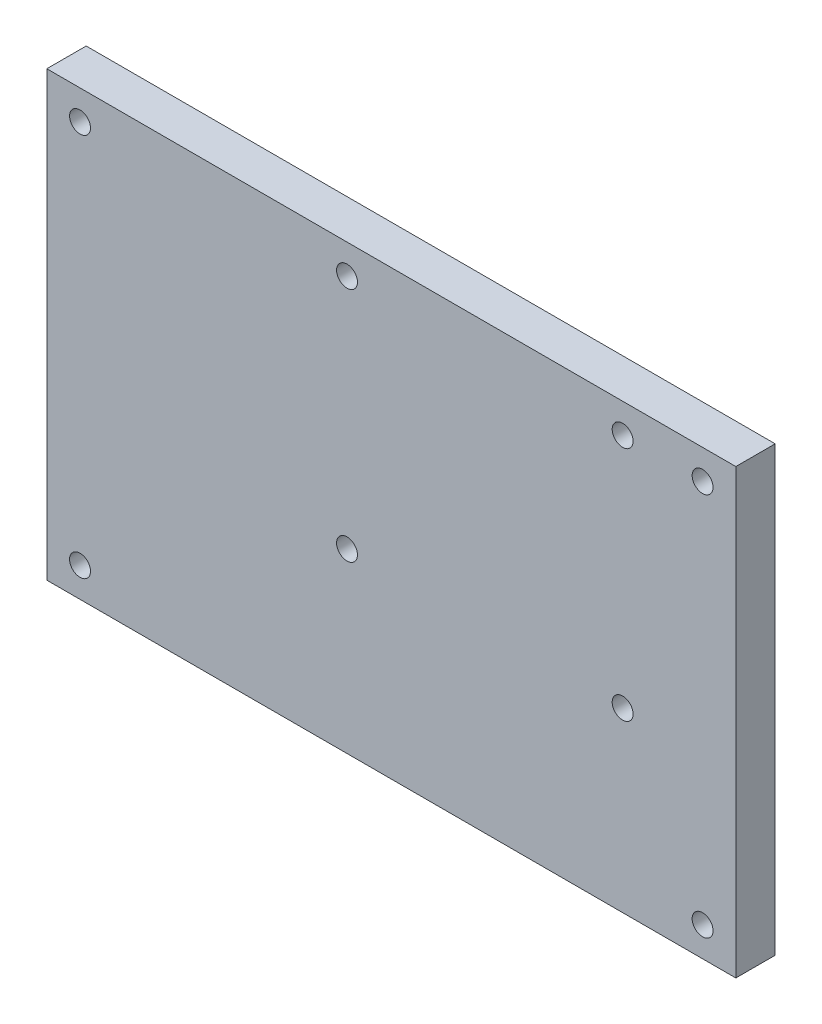
ISO-10303-21;
HEADER;
FILE_DESCRIPTION(('STEP AP214'),'2;1');
FILE_NAME('part.step','',(''),(''),'','','');
FILE_SCHEMA(('AUTOMOTIVE_DESIGN { 1 0 10303 214 1 1 1 1 }'));
ENDSEC;
DATA;
#1=APPLICATION_CONTEXT('core data for automotive mechanical design processes');
#2=APPLICATION_PROTOCOL_DEFINITION('international standard','automotive_design',2000,#1);
#3=PRODUCT_CONTEXT('',#1,'mechanical');
#4=PRODUCT('Part','Part','',(#3));
#5=PRODUCT_RELATED_PRODUCT_CATEGORY('part','',(#4));
#6=PRODUCT_DEFINITION_FORMATION('','',#4);
#7=PRODUCT_DEFINITION_CONTEXT('part definition',#1,'design');
#8=PRODUCT_DEFINITION('design','',#6,#7);
#9=PRODUCT_DEFINITION_SHAPE('','',#8);
#10=(LENGTH_UNIT() NAMED_UNIT(*) SI_UNIT(.MILLI.,.METRE.));
#11=(NAMED_UNIT(*) PLANE_ANGLE_UNIT() SI_UNIT($,.RADIAN.));
#12=(NAMED_UNIT(*) SI_UNIT($,.STERADIAN.) SOLID_ANGLE_UNIT());
#13=UNCERTAINTY_MEASURE_WITH_UNIT(LENGTH_MEASURE(1.E-05),#10,'distance_accuracy_value','');
#14=(GEOMETRIC_REPRESENTATION_CONTEXT(3) GLOBAL_UNCERTAINTY_ASSIGNED_CONTEXT((#13)) GLOBAL_UNIT_ASSIGNED_CONTEXT((#10,
#11,#12)) REPRESENTATION_CONTEXT('',''));
#15=CARTESIAN_POINT('',(0.,0.,0.));
#16=DIRECTION('',(0.,0.,1.));
#17=DIRECTION('',(1.,0.,0.));
#18=AXIS2_PLACEMENT_3D('',#15,#16,#17);
#19=CARTESIAN_POINT('',(0.,0.,25.4));
#20=DIRECTION('',(1.,0.,0.));
#21=DIRECTION('',(0.,0.,-1.));
#22=AXIS2_PLACEMENT_3D('',#19,#20,#21);
#23=PLANE('',#22);
#24=DIRECTION('',(0.,-1.,0.));
#25=VECTOR('',#24,1.);
#26=CARTESIAN_POINT('',(0.,0.,0.));
#27=LINE('',#26,#25);
#28=CARTESIAN_POINT('',(0.,285.75,0.));
#29=VERTEX_POINT('',#28);
#30=CARTESIAN_POINT('',(0.,0.,0.));
#31=VERTEX_POINT('',#30);
#32=EDGE_CURVE('E105',#29,#31,#27,.T.);
#33=ORIENTED_EDGE('',*,*,#32,.T.);
#34=DIRECTION('',(0.,0.,-1.));
#35=VECTOR('',#34,1.);
#36=CARTESIAN_POINT('',(0.,0.,25.4));
#37=LINE('',#36,#35);
#38=CARTESIAN_POINT('',(0.,0.,25.4));
#39=VERTEX_POINT('',#38);
#40=EDGE_CURVE('E11',#39,#31,#37,.T.);
#41=ORIENTED_EDGE('',*,*,#40,.F.);
#42=DIRECTION('',(0.,-1.,0.));
#43=VECTOR('',#42,1.);
#44=CARTESIAN_POINT('',(0.,0.,25.4));
#45=LINE('',#44,#43);
#46=CARTESIAN_POINT('',(0.,285.75,25.4));
#47=VERTEX_POINT('',#46);
#48=EDGE_CURVE('E92',#47,#39,#45,.T.);
#49=ORIENTED_EDGE('',*,*,#48,.F.);
#50=DIRECTION('',(0.,0.,-1.));
#51=VECTOR('',#50,1.);
#52=CARTESIAN_POINT('',(0.,285.75,25.4));
#53=LINE('',#52,#51);
#54=EDGE_CURVE('E101',#47,#29,#53,.T.);
#55=ORIENTED_EDGE('',*,*,#54,.T.);
#56=EDGE_LOOP('',(#33,#41,#49,#55));
#57=FACE_BOUND('',#56,.T.);
#58=ADVANCED_FACE('F39',(#57),#23,.F.);
#59=CARTESIAN_POINT('',(0.,0.,25.4));
#60=DIRECTION('',(0.,1.,0.));
#61=DIRECTION('',(0.,0.,1.));
#62=AXIS2_PLACEMENT_3D('',#59,#60,#61);
#63=PLANE('',#62);
#64=DIRECTION('',(1.,0.,0.));
#65=VECTOR('',#64,1.);
#66=CARTESIAN_POINT('',(0.,0.,0.));
#67=LINE('',#66,#65);
#68=CARTESIAN_POINT('',(444.5,0.,0.));
#69=VERTEX_POINT('',#68);
#70=EDGE_CURVE('E96',#31,#69,#67,.T.);
#71=ORIENTED_EDGE('',*,*,#70,.T.);
#72=DIRECTION('',(0.,0.,-1.));
#73=VECTOR('',#72,1.);
#74=CARTESIAN_POINT('',(444.5,0.,25.4));
#75=LINE('',#74,#73);
#76=CARTESIAN_POINT('',(444.5,0.,25.4));
#77=VERTEX_POINT('',#76);
#78=EDGE_CURVE('E48',#77,#69,#75,.T.);
#79=ORIENTED_EDGE('',*,*,#78,.F.);
#80=DIRECTION('',(1.,0.,0.));
#81=VECTOR('',#80,1.);
#82=CARTESIAN_POINT('',(0.,0.,25.4));
#83=LINE('',#82,#81);
#84=EDGE_CURVE('E87',#39,#77,#83,.T.);
#85=ORIENTED_EDGE('',*,*,#84,.F.);
#86=ORIENTED_EDGE('',*,*,#40,.T.);
#87=EDGE_LOOP('',(#71,#79,#85,#86));
#88=FACE_BOUND('',#87,.T.);
#89=ADVANCED_FACE('F95',(#88),#63,.F.);
#90=CARTESIAN_POINT('',(444.5,0.,25.4));
#91=DIRECTION('',(-1.,0.,0.));
#92=DIRECTION('',(0.,0.,1.));
#93=AXIS2_PLACEMENT_3D('',#90,#91,#92);
#94=PLANE('',#93);
#95=DIRECTION('',(0.,1.,0.));
#96=VECTOR('',#95,1.);
#97=CARTESIAN_POINT('',(444.5,0.,0.));
#98=LINE('',#97,#96);
#99=CARTESIAN_POINT('',(444.5,285.75,0.));
#100=VERTEX_POINT('',#99);
#101=EDGE_CURVE('E74',#69,#100,#98,.T.);
#102=ORIENTED_EDGE('',*,*,#101,.T.);
#103=DIRECTION('',(0.,0.,-1.));
#104=VECTOR('',#103,1.);
#105=CARTESIAN_POINT('',(444.5,285.75,25.4));
#106=LINE('',#105,#104);
#107=CARTESIAN_POINT('',(444.5,285.75,25.4));
#108=VERTEX_POINT('',#107);
#109=EDGE_CURVE('E97',#108,#100,#106,.T.);
#110=ORIENTED_EDGE('',*,*,#109,.F.);
#111=DIRECTION('',(0.,1.,0.));
#112=VECTOR('',#111,1.);
#113=CARTESIAN_POINT('',(444.5,0.,25.4));
#114=LINE('',#113,#112);
#115=EDGE_CURVE('E90',#77,#108,#114,.T.);
#116=ORIENTED_EDGE('',*,*,#115,.F.);
#117=ORIENTED_EDGE('',*,*,#78,.T.);
#118=EDGE_LOOP('',(#102,#110,#116,#117));
#119=FACE_BOUND('',#118,.T.);
#120=ADVANCED_FACE('F99',(#119),#94,.F.);
#121=CARTESIAN_POINT('',(0.,285.75,25.4));
#122=DIRECTION('',(0.,-1.,0.));
#123=DIRECTION('',(0.,0.,-1.));
#124=AXIS2_PLACEMENT_3D('',#121,#122,#123);
#125=PLANE('',#124);
#126=DIRECTION('',(-1.,0.,0.));
#127=VECTOR('',#126,1.);
#128=CARTESIAN_POINT('',(0.,285.75,0.));
#129=LINE('',#128,#127);
#130=EDGE_CURVE('E80',#100,#29,#129,.T.);
#131=ORIENTED_EDGE('',*,*,#130,.T.);
#132=ORIENTED_EDGE('',*,*,#54,.F.);
#133=DIRECTION('',(-1.,0.,0.));
#134=VECTOR('',#133,1.);
#135=CARTESIAN_POINT('',(0.,285.75,25.4));
#136=LINE('',#135,#134);
#137=EDGE_CURVE('E57',#108,#47,#136,.T.);
#138=ORIENTED_EDGE('',*,*,#137,.F.);
#139=ORIENTED_EDGE('',*,*,#109,.T.);
#140=EDGE_LOOP('',(#131,#132,#138,#139));
#141=FACE_BOUND('',#140,.T.);
#142=ADVANCED_FACE('F149',(#141),#125,.F.);
#143=CARTESIAN_POINT('',(0.,0.,25.4));
#144=DIRECTION('',(0.,0.,-1.));
#145=DIRECTION('',(-1.,0.,0.));
#146=AXIS2_PLACEMENT_3D('',#143,#144,#145);
#147=PLANE('',#146);
#148=CARTESIAN_POINT('',(371.475,114.3,25.4));
#149=DIRECTION('',(0.,0.,1.));
#150=DIRECTION('',(1.,0.,0.));
#151=AXIS2_PLACEMENT_3D('',#148,#149,#150);
#152=CIRCLE('',#151,6.74370000000001);
#153=CARTESIAN_POINT('',(378.2187,114.3,25.4));
#154=VERTEX_POINT('',#153);
#155=EDGE_CURVE('E331',#154,#154,#152,.T.);
#156=ORIENTED_EDGE('',*,*,#155,.F.);
#157=EDGE_LOOP('',(#156));
#158=FACE_BOUND('',#157,.T.);
#159=CARTESIAN_POINT('',(193.675,266.7,25.4));
#160=DIRECTION('',(0.,0.,1.));
#161=DIRECTION('',(1.,0.,0.));
#162=AXIS2_PLACEMENT_3D('',#159,#160,#161);
#163=CIRCLE('',#162,6.74369999999999);
#164=CARTESIAN_POINT('',(200.4187,266.7,25.4));
#165=VERTEX_POINT('',#164);
#166=EDGE_CURVE('E348',#165,#165,#163,.T.);
#167=ORIENTED_EDGE('',*,*,#166,.F.);
#168=EDGE_LOOP('',(#167));
#169=FACE_BOUND('',#168,.T.);
#170=CARTESIAN_POINT('',(371.475,266.7,25.4));
#171=DIRECTION('',(0.,0.,1.));
#172=DIRECTION('',(1.,0.,0.));
#173=AXIS2_PLACEMENT_3D('',#170,#171,#172);
#174=CIRCLE('',#173,6.74370000000002);
#175=CARTESIAN_POINT('',(378.2187,266.7,25.4));
#176=VERTEX_POINT('',#175);
#177=EDGE_CURVE('E343',#176,#176,#174,.T.);
#178=ORIENTED_EDGE('',*,*,#177,.F.);
#179=EDGE_LOOP('',(#178));
#180=FACE_BOUND('',#179,.T.);
#181=CARTESIAN_POINT('',(193.675,114.3,25.4));
#182=DIRECTION('',(0.,0.,1.));
#183=DIRECTION('',(1.,0.,0.));
#184=AXIS2_PLACEMENT_3D('',#181,#182,#183);
#185=CIRCLE('',#184,6.74369999999999);
#186=CARTESIAN_POINT('',(200.4187,114.3,25.4));
#187=VERTEX_POINT('',#186);
#188=EDGE_CURVE('E338',#187,#187,#185,.T.);
#189=ORIENTED_EDGE('',*,*,#188,.F.);
#190=EDGE_LOOP('',(#189));
#191=FACE_BOUND('',#190,.T.);
#192=CARTESIAN_POINT('',(423.0624,266.7,25.4));
#193=DIRECTION('',(0.,0.,1.));
#194=DIRECTION('',(1.,0.,0.));
#195=AXIS2_PLACEMENT_3D('',#192,#193,#194);
#196=CIRCLE('',#195,6.74370000000002);
#197=CARTESIAN_POINT('',(429.8061,266.7,25.4));
#198=VERTEX_POINT('',#197);
#199=EDGE_CURVE('E134',#198,#198,#196,.T.);
#200=ORIENTED_EDGE('',*,*,#199,.F.);
#201=EDGE_LOOP('',(#200));
#202=FACE_BOUND('',#201,.T.);
#203=CARTESIAN_POINT('',(21.4376,19.05,25.4));
#204=DIRECTION('',(0.,0.,1.));
#205=DIRECTION('',(1.,0.,0.));
#206=AXIS2_PLACEMENT_3D('',#203,#204,#205);
#207=CIRCLE('',#206,6.7437);
#208=CARTESIAN_POINT('',(28.1813,19.05,25.4));
#209=VERTEX_POINT('',#208);
#210=EDGE_CURVE('E129',#209,#209,#207,.T.);
#211=ORIENTED_EDGE('',*,*,#210,.F.);
#212=EDGE_LOOP('',(#211));
#213=FACE_BOUND('',#212,.T.);
#214=CARTESIAN_POINT('',(423.0624,19.05,25.4));
#215=DIRECTION('',(0.,0.,1.));
#216=DIRECTION('',(1.,0.,0.));
#217=AXIS2_PLACEMENT_3D('',#214,#215,#216);
#218=CIRCLE('',#217,6.74370000000001);
#219=CARTESIAN_POINT('',(429.8061,19.05,25.4));
#220=VERTEX_POINT('',#219);
#221=EDGE_CURVE('E125',#220,#220,#218,.T.);
#222=ORIENTED_EDGE('',*,*,#221,.F.);
#223=EDGE_LOOP('',(#222));
#224=FACE_BOUND('',#223,.T.);
#225=CARTESIAN_POINT('',(21.4376,266.7,25.4));
#226=DIRECTION('',(0.,0.,1.));
#227=DIRECTION('',(1.,0.,0.));
#228=AXIS2_PLACEMENT_3D('',#225,#226,#227);
#229=CIRCLE('',#228,6.74370000000001);
#230=CARTESIAN_POINT('',(28.1813,266.7,25.4));
#231=VERTEX_POINT('',#230);
#232=EDGE_CURVE('E108',#231,#231,#229,.T.);
#233=ORIENTED_EDGE('',*,*,#232,.F.);
#234=EDGE_LOOP('',(#233));
#235=FACE_BOUND('',#234,.T.);
#236=ORIENTED_EDGE('',*,*,#48,.T.);
#237=ORIENTED_EDGE('',*,*,#84,.T.);
#238=ORIENTED_EDGE('',*,*,#115,.T.);
#239=ORIENTED_EDGE('',*,*,#137,.T.);
#240=EDGE_LOOP('',(#236,#237,#238,#239));
#241=FACE_BOUND('',#240,.T.);
#242=ADVANCED_FACE('F88',(#158,#169,#180,#191,#202,#213,#224,#235,#241),#147,.F.);
#243=CARTESIAN_POINT('',(0.,0.,0.));
#244=DIRECTION('',(0.,0.,-1.));
#245=DIRECTION('',(-1.,0.,0.));
#246=AXIS2_PLACEMENT_3D('',#243,#244,#245);
#247=PLANE('',#246);
#248=CARTESIAN_POINT('',(371.475,114.3,0.));
#249=DIRECTION('',(0.,0.,1.));
#250=DIRECTION('',(1.,0.,0.));
#251=AXIS2_PLACEMENT_3D('',#248,#249,#250);
#252=CIRCLE('',#251,6.74370000000001);
#253=CARTESIAN_POINT('',(378.2187,114.3,0.));
#254=VERTEX_POINT('',#253);
#255=EDGE_CURVE('E334',#254,#254,#252,.T.);
#256=ORIENTED_EDGE('',*,*,#255,.T.);
#257=EDGE_LOOP('',(#256));
#258=FACE_BOUND('',#257,.T.);
#259=CARTESIAN_POINT('',(193.675,266.7,0.));
#260=DIRECTION('',(0.,0.,1.));
#261=DIRECTION('',(1.,0.,0.));
#262=AXIS2_PLACEMENT_3D('',#259,#260,#261);
#263=CIRCLE('',#262,6.74369999999999);
#264=CARTESIAN_POINT('',(200.4187,266.7,0.));
#265=VERTEX_POINT('',#264);
#266=EDGE_CURVE('E340',#265,#265,#263,.T.);
#267=ORIENTED_EDGE('',*,*,#266,.T.);
#268=EDGE_LOOP('',(#267));
#269=FACE_BOUND('',#268,.T.);
#270=CARTESIAN_POINT('',(371.475,266.7,0.));
#271=DIRECTION('',(0.,0.,1.));
#272=DIRECTION('',(1.,0.,0.));
#273=AXIS2_PLACEMENT_3D('',#270,#271,#272);
#274=CIRCLE('',#273,6.74370000000002);
#275=CARTESIAN_POINT('',(378.2187,266.7,0.));
#276=VERTEX_POINT('',#275);
#277=EDGE_CURVE('E351',#276,#276,#274,.T.);
#278=ORIENTED_EDGE('',*,*,#277,.T.);
#279=EDGE_LOOP('',(#278));
#280=FACE_BOUND('',#279,.T.);
#281=CARTESIAN_POINT('',(193.675,114.3,0.));
#282=DIRECTION('',(0.,0.,1.));
#283=DIRECTION('',(1.,0.,0.));
#284=AXIS2_PLACEMENT_3D('',#281,#282,#283);
#285=CIRCLE('',#284,6.74369999999999);
#286=CARTESIAN_POINT('',(200.4187,114.3,0.));
#287=VERTEX_POINT('',#286);
#288=EDGE_CURVE('E335',#287,#287,#285,.T.);
#289=ORIENTED_EDGE('',*,*,#288,.T.);
#290=EDGE_LOOP('',(#289));
#291=FACE_BOUND('',#290,.T.);
#292=CARTESIAN_POINT('',(423.0624,266.7,0.));
#293=DIRECTION('',(0.,0.,1.));
#294=DIRECTION('',(1.,0.,0.));
#295=AXIS2_PLACEMENT_3D('',#292,#293,#294);
#296=CIRCLE('',#295,9.52500000000002);
#297=CARTESIAN_POINT('',(413.5374,266.7,0.));
#298=VERTEX_POINT('',#297);
#299=EDGE_CURVE('E361',#298,#298,#296,.T.);
#300=ORIENTED_EDGE('',*,*,#299,.T.);
#301=EDGE_LOOP('',(#300));
#302=FACE_BOUND('',#301,.T.);
#303=CARTESIAN_POINT('',(21.4376,19.05,0.));
#304=DIRECTION('',(0.,0.,1.));
#305=DIRECTION('',(1.,0.,0.));
#306=AXIS2_PLACEMENT_3D('',#303,#304,#305);
#307=CIRCLE('',#306,9.525);
#308=CARTESIAN_POINT('',(11.9126,19.05,0.));
#309=VERTEX_POINT('',#308);
#310=EDGE_CURVE('E367',#309,#309,#307,.T.);
#311=ORIENTED_EDGE('',*,*,#310,.T.);
#312=EDGE_LOOP('',(#311));
#313=FACE_BOUND('',#312,.T.);
#314=CARTESIAN_POINT('',(423.0624,19.05,0.));
#315=DIRECTION('',(0.,0.,1.));
#316=DIRECTION('',(1.,0.,0.));
#317=AXIS2_PLACEMENT_3D('',#314,#315,#316);
#318=CIRCLE('',#317,9.52500000000002);
#319=CARTESIAN_POINT('',(413.5374,19.05,0.));
#320=VERTEX_POINT('',#319);
#321=EDGE_CURVE('E355',#320,#320,#318,.T.);
#322=ORIENTED_EDGE('',*,*,#321,.T.);
#323=EDGE_LOOP('',(#322));
#324=FACE_BOUND('',#323,.T.);
#325=CARTESIAN_POINT('',(21.4376,266.7,0.));
#326=DIRECTION('',(0.,0.,1.));
#327=DIRECTION('',(1.,0.,0.));
#328=AXIS2_PLACEMENT_3D('',#325,#326,#327);
#329=CIRCLE('',#328,9.525);
#330=CARTESIAN_POINT('',(11.9126,266.7,0.));
#331=VERTEX_POINT('',#330);
#332=EDGE_CURVE('E138',#331,#331,#329,.T.);
#333=ORIENTED_EDGE('',*,*,#332,.T.);
#334=EDGE_LOOP('',(#333));
#335=FACE_BOUND('',#334,.T.);
#336=ORIENTED_EDGE('',*,*,#32,.F.);
#337=ORIENTED_EDGE('',*,*,#130,.F.);
#338=ORIENTED_EDGE('',*,*,#101,.F.);
#339=ORIENTED_EDGE('',*,*,#70,.F.);
#340=EDGE_LOOP('',(#336,#337,#338,#339));
#341=FACE_BOUND('',#340,.T.);
#342=ADVANCED_FACE('F148',(#258,#269,#280,#291,#302,#313,#324,#335,#341),#247,.T.);
#343=CARTESIAN_POINT('',(21.4376,266.7,25.4));
#344=DIRECTION('',(0.,0.,-1.));
#345=DIRECTION('',(-1.,0.,0.));
#346=AXIS2_PLACEMENT_3D('',#343,#344,#345);
#347=CYLINDRICAL_SURFACE('',#346,6.74370000000001);
#348=CARTESIAN_POINT('',(21.4376,266.7,7.62));
#349=DIRECTION('',(0.,0.,1.));
#350=DIRECTION('',(1.,0.,0.));
#351=AXIS2_PLACEMENT_3D('',#348,#349,#350);
#352=CIRCLE('',#351,6.74370000000001);
#353=CARTESIAN_POINT('',(28.1813,266.7,7.62));
#354=VERTEX_POINT('',#353);
#355=EDGE_CURVE('E42',#354,#354,#352,.T.);
#356=ORIENTED_EDGE('',*,*,#355,.F.);
#357=EDGE_LOOP('',(#356));
#358=FACE_BOUND('',#357,.T.);
#359=ORIENTED_EDGE('',*,*,#232,.T.);
#360=EDGE_LOOP('',(#359));
#361=FACE_BOUND('',#360,.T.);
#362=ADVANCED_FACE('F145',(#358,#361),#347,.F.);
#363=CARTESIAN_POINT('',(423.0624,19.05,25.4));
#364=DIRECTION('',(0.,0.,-1.));
#365=DIRECTION('',(-1.,0.,0.));
#366=AXIS2_PLACEMENT_3D('',#363,#364,#365);
#367=CYLINDRICAL_SURFACE('',#366,6.74370000000001);
#368=CARTESIAN_POINT('',(423.0624,19.05,7.62));
#369=DIRECTION('',(0.,0.,1.));
#370=DIRECTION('',(1.,0.,0.));
#371=AXIS2_PLACEMENT_3D('',#368,#369,#370);
#372=CIRCLE('',#371,6.74370000000001);
#373=CARTESIAN_POINT('',(429.8061,19.05,7.62));
#374=VERTEX_POINT('',#373);
#375=EDGE_CURVE('E120',#374,#374,#372,.T.);
#376=ORIENTED_EDGE('',*,*,#375,.F.);
#377=EDGE_LOOP('',(#376));
#378=FACE_BOUND('',#377,.T.);
#379=ORIENTED_EDGE('',*,*,#221,.T.);
#380=EDGE_LOOP('',(#379));
#381=FACE_BOUND('',#380,.T.);
#382=ADVANCED_FACE('F188',(#378,#381),#367,.F.);
#383=CARTESIAN_POINT('',(21.4376,19.05,25.4));
#384=DIRECTION('',(0.,0.,-1.));
#385=DIRECTION('',(-1.,0.,0.));
#386=AXIS2_PLACEMENT_3D('',#383,#384,#385);
#387=CYLINDRICAL_SURFACE('',#386,6.7437);
#388=CARTESIAN_POINT('',(21.4376,19.05,7.62));
#389=DIRECTION('',(0.,0.,1.));
#390=DIRECTION('',(1.,0.,0.));
#391=AXIS2_PLACEMENT_3D('',#388,#389,#390);
#392=CIRCLE('',#391,6.7437);
#393=CARTESIAN_POINT('',(28.1813,19.05,7.62));
#394=VERTEX_POINT('',#393);
#395=EDGE_CURVE('E117',#394,#394,#392,.T.);
#396=ORIENTED_EDGE('',*,*,#395,.F.);
#397=EDGE_LOOP('',(#396));
#398=FACE_BOUND('',#397,.T.);
#399=ORIENTED_EDGE('',*,*,#210,.T.);
#400=EDGE_LOOP('',(#399));
#401=FACE_BOUND('',#400,.T.);
#402=ADVANCED_FACE('F197',(#398,#401),#387,.F.);
#403=CARTESIAN_POINT('',(423.0624,266.7,25.4));
#404=DIRECTION('',(0.,0.,-1.));
#405=DIRECTION('',(-1.,0.,0.));
#406=AXIS2_PLACEMENT_3D('',#403,#404,#405);
#407=CYLINDRICAL_SURFACE('',#406,6.74370000000002);
#408=CARTESIAN_POINT('',(423.0624,266.7,7.62));
#409=DIRECTION('',(0.,0.,1.));
#410=DIRECTION('',(1.,0.,0.));
#411=AXIS2_PLACEMENT_3D('',#408,#409,#410);
#412=CIRCLE('',#411,6.74370000000002);
#413=CARTESIAN_POINT('',(429.8061,266.7,7.62));
#414=VERTEX_POINT('',#413);
#415=EDGE_CURVE('E114',#414,#414,#412,.T.);
#416=ORIENTED_EDGE('',*,*,#415,.F.);
#417=EDGE_LOOP('',(#416));
#418=FACE_BOUND('',#417,.T.);
#419=ORIENTED_EDGE('',*,*,#199,.T.);
#420=EDGE_LOOP('',(#419));
#421=FACE_BOUND('',#420,.T.);
#422=ADVANCED_FACE('F206',(#418,#421),#407,.F.);
#423=CARTESIAN_POINT('',(423.0624,266.7,7.62));
#424=DIRECTION('',(0.,0.,-1.));
#425=DIRECTION('',(-1.,0.,0.));
#426=AXIS2_PLACEMENT_3D('',#423,#424,#425);
#427=CYLINDRICAL_SURFACE('',#426,9.52500000000002);
#428=CARTESIAN_POINT('',(423.0624,266.7,7.62));
#429=DIRECTION('',(0.,0.,1.));
#430=DIRECTION('',(1.,0.,0.));
#431=AXIS2_PLACEMENT_3D('',#428,#429,#430);
#432=CIRCLE('',#431,9.52500000000002);
#433=CARTESIAN_POINT('',(413.5374,266.7,7.62));
#434=VERTEX_POINT('',#433);
#435=EDGE_CURVE('E364',#434,#434,#432,.T.);
#436=CARTESIAN_POINT('',(413.5374,266.7,7.62));
#437=CARTESIAN_POINT('',(413.5374,266.7,7.540625));
#438=CARTESIAN_POINT('',(413.5374,266.7,7.46125));
#439=CARTESIAN_POINT('',(413.5374,266.7,7.3025));
#440=CARTESIAN_POINT('',(413.5374,266.7,7.223125));
#441=CARTESIAN_POINT('',(413.5374,266.7,7.064375));
#442=CARTESIAN_POINT('',(413.5374,266.7,6.985));
#443=CARTESIAN_POINT('',(413.5374,266.7,6.82625));
#444=CARTESIAN_POINT('',(413.5374,266.7,6.746875));
#445=CARTESIAN_POINT('',(413.5374,266.7,6.588125));
#446=CARTESIAN_POINT('',(413.5374,266.7,6.50875));
#447=CARTESIAN_POINT('',(413.5374,266.7,6.35));
#448=CARTESIAN_POINT('',(413.5374,266.7,6.270625));
#449=CARTESIAN_POINT('',(413.5374,266.7,6.111875));
#450=CARTESIAN_POINT('',(413.5374,266.7,6.0325));
#451=CARTESIAN_POINT('',(413.5374,266.7,5.87375));
#452=CARTESIAN_POINT('',(413.5374,266.7,5.794375));
#453=CARTESIAN_POINT('',(413.5374,266.7,5.635625));
#454=CARTESIAN_POINT('',(413.5374,266.7,5.55625));
#455=CARTESIAN_POINT('',(413.5374,266.7,5.3975));
#456=CARTESIAN_POINT('',(413.5374,266.7,5.318125));
#457=CARTESIAN_POINT('',(413.5374,266.7,5.159375));
#458=CARTESIAN_POINT('',(413.5374,266.7,5.08));
#459=CARTESIAN_POINT('',(413.5374,266.7,4.92125));
#460=CARTESIAN_POINT('',(413.5374,266.7,4.841875));
#461=CARTESIAN_POINT('',(413.5374,266.7,4.683125));
#462=CARTESIAN_POINT('',(413.5374,266.7,4.60375));
#463=CARTESIAN_POINT('',(413.5374,266.7,4.445));
#464=CARTESIAN_POINT('',(413.5374,266.7,4.365625));
#465=CARTESIAN_POINT('',(413.5374,266.7,4.206875));
#466=CARTESIAN_POINT('',(413.5374,266.7,4.1275));
#467=CARTESIAN_POINT('',(413.5374,266.7,3.96875));
#468=CARTESIAN_POINT('',(413.5374,266.7,3.889375));
#469=CARTESIAN_POINT('',(413.5374,266.7,3.730625));
#470=CARTESIAN_POINT('',(413.5374,266.7,3.65125));
#471=CARTESIAN_POINT('',(413.5374,266.7,3.4925));
#472=CARTESIAN_POINT('',(413.5374,266.7,3.413125));
#473=CARTESIAN_POINT('',(413.5374,266.7,3.254375));
#474=CARTESIAN_POINT('',(413.5374,266.7,3.175));
#475=CARTESIAN_POINT('',(413.5374,266.7,3.01625));
#476=CARTESIAN_POINT('',(413.5374,266.7,2.936875));
#477=CARTESIAN_POINT('',(413.5374,266.7,2.778125));
#478=CARTESIAN_POINT('',(413.5374,266.7,2.69875));
#479=CARTESIAN_POINT('',(413.5374,266.7,2.54));
#480=CARTESIAN_POINT('',(413.5374,266.7,2.460625));
#481=CARTESIAN_POINT('',(413.5374,266.7,2.301875));
#482=CARTESIAN_POINT('',(413.5374,266.7,2.2225));
#483=CARTESIAN_POINT('',(413.5374,266.7,2.06375));
#484=CARTESIAN_POINT('',(413.5374,266.7,1.984375));
#485=CARTESIAN_POINT('',(413.5374,266.7,1.825625));
#486=CARTESIAN_POINT('',(413.5374,266.7,1.74625));
#487=CARTESIAN_POINT('',(413.5374,266.7,1.5875));
#488=CARTESIAN_POINT('',(413.5374,266.7,1.508125));
#489=CARTESIAN_POINT('',(413.5374,266.7,1.349375));
#490=CARTESIAN_POINT('',(413.5374,266.7,1.27));
#491=CARTESIAN_POINT('',(413.5374,266.7,1.11125));
#492=CARTESIAN_POINT('',(413.5374,266.7,1.031875));
#493=CARTESIAN_POINT('',(413.5374,266.7,0.873125));
#494=CARTESIAN_POINT('',(413.5374,266.7,0.79375));
#495=CARTESIAN_POINT('',(413.5374,266.7,0.635));
#496=CARTESIAN_POINT('',(413.5374,266.7,0.555625));
#497=CARTESIAN_POINT('',(413.5374,266.7,0.396875));
#498=CARTESIAN_POINT('',(413.5374,266.7,0.3175));
#499=CARTESIAN_POINT('',(413.5374,266.7,0.15875));
#500=CARTESIAN_POINT('',(413.5374,266.7,0.0793749999999999));
#501=CARTESIAN_POINT('',(413.5374,266.7,0.));
#502=B_SPLINE_CURVE_WITH_KNOTS('',3,(#436,#437,#438,#439,#440,#441,#442,#443,#444,#445,#446,
#447,#448,#449,#450,#451,#452,#453,#454,#455,#456,#457,#458,#459,#460,#461,#462,#463,#464,#465,
#466,#467,#468,#469,#470,#471,#472,#473,#474,#475,#476,#477,#478,#479,#480,#481,#482,#483,#484,
#485,#486,#487,#488,#489,#490,#491,#492,#493,#494,#495,#496,#497,#498,#499,#500,#501),
.UNSPECIFIED.,.F.,.F.,(4,2,2,2,2,2,2,2,2,2,2,2,2,2,2,2,2,2,2,2,2,2,2,2,2,2,2,2,2,2,2,2,4),(0.,
0.238125,0.476249999999999,0.714375,0.952499999999999,1.190625,1.42875,1.666875,1.905,2.143125,
2.38125,2.619375,2.8575,3.095625,3.33375,3.571875,3.81,4.048125,4.28625,4.524375,4.7625,
5.000625,5.23875,5.476875,5.715,5.953125,6.19125,6.429375,6.6675,6.905625,7.14375,7.381875,
7.62),.UNSPECIFIED.);
#503=EDGE_CURVE('BSEAM215',#434,#298,#502,.T.);
#504=ORIENTED_EDGE('',*,*,#435,.T.);
#505=ORIENTED_EDGE('',*,*,#299,.F.);
#506=ORIENTED_EDGE('',*,*,#503,.T.);
#507=ORIENTED_EDGE('',*,*,#503,.F.);
#508=EDGE_LOOP('',(#504,#506,#505,#507));
#509=FACE_BOUND('',#508,.T.);
#510=ADVANCED_FACE('F215',(#509),#427,.F.);
#511=CARTESIAN_POINT('',(423.0624,266.7,7.62));
#512=DIRECTION('',(0.,0.,1.));
#513=DIRECTION('',(1.,0.,0.));
#514=AXIS2_PLACEMENT_3D('',#511,#512,#513);
#515=PLANE('',#514);
#516=ORIENTED_EDGE('',*,*,#415,.T.);
#517=EDGE_LOOP('',(#516));
#518=FACE_BOUND('',#517,.T.);
#519=ORIENTED_EDGE('',*,*,#435,.F.);
#520=EDGE_LOOP('',(#519));
#521=FACE_BOUND('',#520,.T.);
#522=ADVANCED_FACE('F224',(#518,#521),#515,.F.);
#523=CARTESIAN_POINT('',(21.4376,19.05,7.62));
#524=DIRECTION('',(0.,0.,-1.));
#525=DIRECTION('',(-1.,0.,0.));
#526=AXIS2_PLACEMENT_3D('',#523,#524,#525);
#527=CYLINDRICAL_SURFACE('',#526,9.525);
#528=CARTESIAN_POINT('',(21.4376,19.05,7.62));
#529=DIRECTION('',(0.,0.,1.));
#530=DIRECTION('',(1.,0.,0.));
#531=AXIS2_PLACEMENT_3D('',#528,#529,#530);
#532=CIRCLE('',#531,9.525);
#533=CARTESIAN_POINT('',(11.9126,19.05,7.62));
#534=VERTEX_POINT('',#533);
#535=EDGE_CURVE('E358',#534,#534,#532,.T.);
#536=CARTESIAN_POINT('',(11.9126,19.05,7.62));
#537=CARTESIAN_POINT('',(11.9126,19.05,7.540625));
#538=CARTESIAN_POINT('',(11.9126,19.05,7.46125));
#539=CARTESIAN_POINT('',(11.9126,19.05,7.3025));
#540=CARTESIAN_POINT('',(11.9126,19.05,7.223125));
#541=CARTESIAN_POINT('',(11.9126,19.05,7.064375));
#542=CARTESIAN_POINT('',(11.9126,19.05,6.985));
#543=CARTESIAN_POINT('',(11.9126,19.05,6.82625));
#544=CARTESIAN_POINT('',(11.9126,19.05,6.746875));
#545=CARTESIAN_POINT('',(11.9126,19.05,6.588125));
#546=CARTESIAN_POINT('',(11.9126,19.05,6.50875));
#547=CARTESIAN_POINT('',(11.9126,19.05,6.35));
#548=CARTESIAN_POINT('',(11.9126,19.05,6.270625));
#549=CARTESIAN_POINT('',(11.9126,19.05,6.111875));
#550=CARTESIAN_POINT('',(11.9126,19.05,6.0325));
#551=CARTESIAN_POINT('',(11.9126,19.05,5.87375));
#552=CARTESIAN_POINT('',(11.9126,19.05,5.794375));
#553=CARTESIAN_POINT('',(11.9126,19.05,5.635625));
#554=CARTESIAN_POINT('',(11.9126,19.05,5.55625));
#555=CARTESIAN_POINT('',(11.9126,19.05,5.3975));
#556=CARTESIAN_POINT('',(11.9126,19.05,5.318125));
#557=CARTESIAN_POINT('',(11.9126,19.05,5.159375));
#558=CARTESIAN_POINT('',(11.9126,19.05,5.08));
#559=CARTESIAN_POINT('',(11.9126,19.05,4.92125));
#560=CARTESIAN_POINT('',(11.9126,19.05,4.841875));
#561=CARTESIAN_POINT('',(11.9126,19.05,4.683125));
#562=CARTESIAN_POINT('',(11.9126,19.05,4.60375));
#563=CARTESIAN_POINT('',(11.9126,19.05,4.445));
#564=CARTESIAN_POINT('',(11.9126,19.05,4.365625));
#565=CARTESIAN_POINT('',(11.9126,19.05,4.206875));
#566=CARTESIAN_POINT('',(11.9126,19.05,4.1275));
#567=CARTESIAN_POINT('',(11.9126,19.05,3.96875));
#568=CARTESIAN_POINT('',(11.9126,19.05,3.889375));
#569=CARTESIAN_POINT('',(11.9126,19.05,3.730625));
#570=CARTESIAN_POINT('',(11.9126,19.05,3.65125));
#571=CARTESIAN_POINT('',(11.9126,19.05,3.4925));
#572=CARTESIAN_POINT('',(11.9126,19.05,3.413125));
#573=CARTESIAN_POINT('',(11.9126,19.05,3.254375));
#574=CARTESIAN_POINT('',(11.9126,19.05,3.175));
#575=CARTESIAN_POINT('',(11.9126,19.05,3.01625));
#576=CARTESIAN_POINT('',(11.9126,19.05,2.936875));
#577=CARTESIAN_POINT('',(11.9126,19.05,2.778125));
#578=CARTESIAN_POINT('',(11.9126,19.05,2.69875));
#579=CARTESIAN_POINT('',(11.9126,19.05,2.54));
#580=CARTESIAN_POINT('',(11.9126,19.05,2.460625));
#581=CARTESIAN_POINT('',(11.9126,19.05,2.301875));
#582=CARTESIAN_POINT('',(11.9126,19.05,2.2225));
#583=CARTESIAN_POINT('',(11.9126,19.05,2.06375));
#584=CARTESIAN_POINT('',(11.9126,19.05,1.984375));
#585=CARTESIAN_POINT('',(11.9126,19.05,1.825625));
#586=CARTESIAN_POINT('',(11.9126,19.05,1.74625));
#587=CARTESIAN_POINT('',(11.9126,19.05,1.5875));
#588=CARTESIAN_POINT('',(11.9126,19.05,1.508125));
#589=CARTESIAN_POINT('',(11.9126,19.05,1.349375));
#590=CARTESIAN_POINT('',(11.9126,19.05,1.27));
#591=CARTESIAN_POINT('',(11.9126,19.05,1.11125));
#592=CARTESIAN_POINT('',(11.9126,19.05,1.031875));
#593=CARTESIAN_POINT('',(11.9126,19.05,0.873125));
#594=CARTESIAN_POINT('',(11.9126,19.05,0.79375));
#595=CARTESIAN_POINT('',(11.9126,19.05,0.635));
#596=CARTESIAN_POINT('',(11.9126,19.05,0.555625));
#597=CARTESIAN_POINT('',(11.9126,19.05,0.396875));
#598=CARTESIAN_POINT('',(11.9126,19.05,0.3175));
#599=CARTESIAN_POINT('',(11.9126,19.05,0.15875));
#600=CARTESIAN_POINT('',(11.9126,19.05,0.0793749999999999));
#601=CARTESIAN_POINT('',(11.9126,19.05,0.));
#602=B_SPLINE_CURVE_WITH_KNOTS('',3,(#536,#537,#538,#539,#540,#541,#542,#543,#544,#545,#546,
#547,#548,#549,#550,#551,#552,#553,#554,#555,#556,#557,#558,#559,#560,#561,#562,#563,#564,#565,
#566,#567,#568,#569,#570,#571,#572,#573,#574,#575,#576,#577,#578,#579,#580,#581,#582,#583,#584,
#585,#586,#587,#588,#589,#590,#591,#592,#593,#594,#595,#596,#597,#598,#599,#600,#601),
.UNSPECIFIED.,.F.,.F.,(4,2,2,2,2,2,2,2,2,2,2,2,2,2,2,2,2,2,2,2,2,2,2,2,2,2,2,2,2,2,2,2,4),(0.,
0.238125,0.476249999999999,0.714375,0.952499999999999,1.190625,1.42875,1.666875,1.905,2.143125,
2.38125,2.619375,2.8575,3.095625,3.33375,3.571875,3.81,4.048125,4.28625,4.524375,4.7625,
5.000625,5.23875,5.476875,5.715,5.953125,6.19125,6.429375,6.6675,6.905625,7.14375,7.381875,
7.62),.UNSPECIFIED.);
#603=EDGE_CURVE('BSEAM233',#534,#309,#602,.T.);
#604=ORIENTED_EDGE('',*,*,#535,.T.);
#605=ORIENTED_EDGE('',*,*,#310,.F.);
#606=ORIENTED_EDGE('',*,*,#603,.T.);
#607=ORIENTED_EDGE('',*,*,#603,.F.);
#608=EDGE_LOOP('',(#604,#606,#605,#607));
#609=FACE_BOUND('',#608,.T.);
#610=ADVANCED_FACE('F233',(#609),#527,.F.);
#611=CARTESIAN_POINT('',(21.4376,19.05,7.62));
#612=DIRECTION('',(0.,0.,1.));
#613=DIRECTION('',(1.,0.,0.));
#614=AXIS2_PLACEMENT_3D('',#611,#612,#613);
#615=PLANE('',#614);
#616=ORIENTED_EDGE('',*,*,#395,.T.);
#617=EDGE_LOOP('',(#616));
#618=FACE_BOUND('',#617,.T.);
#619=ORIENTED_EDGE('',*,*,#535,.F.);
#620=EDGE_LOOP('',(#619));
#621=FACE_BOUND('',#620,.T.);
#622=ADVANCED_FACE('F242',(#618,#621),#615,.F.);
#623=CARTESIAN_POINT('',(423.0624,19.05,7.62));
#624=DIRECTION('',(0.,0.,-1.));
#625=DIRECTION('',(-1.,0.,0.));
#626=AXIS2_PLACEMENT_3D('',#623,#624,#625);
#627=CYLINDRICAL_SURFACE('',#626,9.52500000000002);
#628=CARTESIAN_POINT('',(423.0624,19.05,7.62));
#629=DIRECTION('',(0.,0.,1.));
#630=DIRECTION('',(1.,0.,0.));
#631=AXIS2_PLACEMENT_3D('',#628,#629,#630);
#632=CIRCLE('',#631,9.52500000000002);
#633=CARTESIAN_POINT('',(413.5374,19.05,7.62));
#634=VERTEX_POINT('',#633);
#635=EDGE_CURVE('E353',#634,#634,#632,.T.);
#636=CARTESIAN_POINT('',(413.5374,19.05,7.62));
#637=CARTESIAN_POINT('',(413.5374,19.05,7.540625));
#638=CARTESIAN_POINT('',(413.5374,19.05,7.46125));
#639=CARTESIAN_POINT('',(413.5374,19.05,7.3025));
#640=CARTESIAN_POINT('',(413.5374,19.05,7.223125));
#641=CARTESIAN_POINT('',(413.5374,19.05,7.064375));
#642=CARTESIAN_POINT('',(413.5374,19.05,6.985));
#643=CARTESIAN_POINT('',(413.5374,19.05,6.82625));
#644=CARTESIAN_POINT('',(413.5374,19.05,6.746875));
#645=CARTESIAN_POINT('',(413.5374,19.05,6.588125));
#646=CARTESIAN_POINT('',(413.5374,19.05,6.50875));
#647=CARTESIAN_POINT('',(413.5374,19.05,6.35));
#648=CARTESIAN_POINT('',(413.5374,19.05,6.270625));
#649=CARTESIAN_POINT('',(413.5374,19.05,6.111875));
#650=CARTESIAN_POINT('',(413.5374,19.05,6.0325));
#651=CARTESIAN_POINT('',(413.5374,19.05,5.87375));
#652=CARTESIAN_POINT('',(413.5374,19.05,5.794375));
#653=CARTESIAN_POINT('',(413.5374,19.05,5.635625));
#654=CARTESIAN_POINT('',(413.5374,19.05,5.55625));
#655=CARTESIAN_POINT('',(413.5374,19.05,5.3975));
#656=CARTESIAN_POINT('',(413.5374,19.05,5.318125));
#657=CARTESIAN_POINT('',(413.5374,19.05,5.159375));
#658=CARTESIAN_POINT('',(413.5374,19.05,5.08));
#659=CARTESIAN_POINT('',(413.5374,19.05,4.92125));
#660=CARTESIAN_POINT('',(413.5374,19.05,4.841875));
#661=CARTESIAN_POINT('',(413.5374,19.05,4.683125));
#662=CARTESIAN_POINT('',(413.5374,19.05,4.60375));
#663=CARTESIAN_POINT('',(413.5374,19.05,4.445));
#664=CARTESIAN_POINT('',(413.5374,19.05,4.365625));
#665=CARTESIAN_POINT('',(413.5374,19.05,4.206875));
#666=CARTESIAN_POINT('',(413.5374,19.05,4.1275));
#667=CARTESIAN_POINT('',(413.5374,19.05,3.96875));
#668=CARTESIAN_POINT('',(413.5374,19.05,3.889375));
#669=CARTESIAN_POINT('',(413.5374,19.05,3.730625));
#670=CARTESIAN_POINT('',(413.5374,19.05,3.65125));
#671=CARTESIAN_POINT('',(413.5374,19.05,3.4925));
#672=CARTESIAN_POINT('',(413.5374,19.05,3.413125));
#673=CARTESIAN_POINT('',(413.5374,19.05,3.254375));
#674=CARTESIAN_POINT('',(413.5374,19.05,3.175));
#675=CARTESIAN_POINT('',(413.5374,19.05,3.01625));
#676=CARTESIAN_POINT('',(413.5374,19.05,2.936875));
#677=CARTESIAN_POINT('',(413.5374,19.05,2.778125));
#678=CARTESIAN_POINT('',(413.5374,19.05,2.69875));
#679=CARTESIAN_POINT('',(413.5374,19.05,2.54));
#680=CARTESIAN_POINT('',(413.5374,19.05,2.460625));
#681=CARTESIAN_POINT('',(413.5374,19.05,2.301875));
#682=CARTESIAN_POINT('',(413.5374,19.05,2.2225));
#683=CARTESIAN_POINT('',(413.5374,19.05,2.06375));
#684=CARTESIAN_POINT('',(413.5374,19.05,1.984375));
#685=CARTESIAN_POINT('',(413.5374,19.05,1.825625));
#686=CARTESIAN_POINT('',(413.5374,19.05,1.74625));
#687=CARTESIAN_POINT('',(413.5374,19.05,1.5875));
#688=CARTESIAN_POINT('',(413.5374,19.05,1.508125));
#689=CARTESIAN_POINT('',(413.5374,19.05,1.349375));
#690=CARTESIAN_POINT('',(413.5374,19.05,1.27));
#691=CARTESIAN_POINT('',(413.5374,19.05,1.11125));
#692=CARTESIAN_POINT('',(413.5374,19.05,1.031875));
#693=CARTESIAN_POINT('',(413.5374,19.05,0.873125));
#694=CARTESIAN_POINT('',(413.5374,19.05,0.79375));
#695=CARTESIAN_POINT('',(413.5374,19.05,0.635));
#696=CARTESIAN_POINT('',(413.5374,19.05,0.555625));
#697=CARTESIAN_POINT('',(413.5374,19.05,0.396875));
#698=CARTESIAN_POINT('',(413.5374,19.05,0.3175));
#699=CARTESIAN_POINT('',(413.5374,19.05,0.15875));
#700=CARTESIAN_POINT('',(413.5374,19.05,0.0793749999999999));
#701=CARTESIAN_POINT('',(413.5374,19.05,0.));
#702=B_SPLINE_CURVE_WITH_KNOTS('',3,(#636,#637,#638,#639,#640,#641,#642,#643,#644,#645,#646,
#647,#648,#649,#650,#651,#652,#653,#654,#655,#656,#657,#658,#659,#660,#661,#662,#663,#664,#665,
#666,#667,#668,#669,#670,#671,#672,#673,#674,#675,#676,#677,#678,#679,#680,#681,#682,#683,#684,
#685,#686,#687,#688,#689,#690,#691,#692,#693,#694,#695,#696,#697,#698,#699,#700,#701),
.UNSPECIFIED.,.F.,.F.,(4,2,2,2,2,2,2,2,2,2,2,2,2,2,2,2,2,2,2,2,2,2,2,2,2,2,2,2,2,2,2,2,4),(0.,
0.238125,0.476249999999999,0.714375,0.952499999999999,1.190625,1.42875,1.666875,1.905,2.143125,
2.38125,2.619375,2.8575,3.095625,3.33375,3.571875,3.81,4.048125,4.28625,4.524375,4.7625,
5.000625,5.23875,5.476875,5.715,5.953125,6.19125,6.429375,6.6675,6.905625,7.14375,7.381875,
7.62),.UNSPECIFIED.);
#703=EDGE_CURVE('BSEAM251',#634,#320,#702,.T.);
#704=ORIENTED_EDGE('',*,*,#635,.T.);
#705=ORIENTED_EDGE('',*,*,#321,.F.);
#706=ORIENTED_EDGE('',*,*,#703,.T.);
#707=ORIENTED_EDGE('',*,*,#703,.F.);
#708=EDGE_LOOP('',(#704,#706,#705,#707));
#709=FACE_BOUND('',#708,.T.);
#710=ADVANCED_FACE('F251',(#709),#627,.F.);
#711=CARTESIAN_POINT('',(423.0624,19.05,7.62));
#712=DIRECTION('',(0.,0.,1.));
#713=DIRECTION('',(1.,0.,0.));
#714=AXIS2_PLACEMENT_3D('',#711,#712,#713);
#715=PLANE('',#714);
#716=ORIENTED_EDGE('',*,*,#375,.T.);
#717=EDGE_LOOP('',(#716));
#718=FACE_BOUND('',#717,.T.);
#719=ORIENTED_EDGE('',*,*,#635,.F.);
#720=EDGE_LOOP('',(#719));
#721=FACE_BOUND('',#720,.T.);
#722=ADVANCED_FACE('F260',(#718,#721),#715,.F.);
#723=CARTESIAN_POINT('',(21.4376,266.7,7.62));
#724=DIRECTION('',(0.,0.,-1.));
#725=DIRECTION('',(-1.,0.,0.));
#726=AXIS2_PLACEMENT_3D('',#723,#724,#725);
#727=CYLINDRICAL_SURFACE('',#726,9.525);
#728=CARTESIAN_POINT('',(21.4376,266.7,7.62));
#729=DIRECTION('',(0.,0.,1.));
#730=DIRECTION('',(1.,0.,0.));
#731=AXIS2_PLACEMENT_3D('',#728,#729,#730);
#732=CIRCLE('',#731,9.525);
#733=CARTESIAN_POINT('',(11.9126,266.7,7.62));
#734=VERTEX_POINT('',#733);
#735=EDGE_CURVE('E118',#734,#734,#732,.T.);
#736=CARTESIAN_POINT('',(11.9126,266.7,7.62));
#737=CARTESIAN_POINT('',(11.9126,266.7,7.540625));
#738=CARTESIAN_POINT('',(11.9126,266.7,7.46125));
#739=CARTESIAN_POINT('',(11.9126,266.7,7.3025));
#740=CARTESIAN_POINT('',(11.9126,266.7,7.223125));
#741=CARTESIAN_POINT('',(11.9126,266.7,7.064375));
#742=CARTESIAN_POINT('',(11.9126,266.7,6.985));
#743=CARTESIAN_POINT('',(11.9126,266.7,6.82625));
#744=CARTESIAN_POINT('',(11.9126,266.7,6.746875));
#745=CARTESIAN_POINT('',(11.9126,266.7,6.588125));
#746=CARTESIAN_POINT('',(11.9126,266.7,6.50875));
#747=CARTESIAN_POINT('',(11.9126,266.7,6.35));
#748=CARTESIAN_POINT('',(11.9126,266.7,6.270625));
#749=CARTESIAN_POINT('',(11.9126,266.7,6.111875));
#750=CARTESIAN_POINT('',(11.9126,266.7,6.0325));
#751=CARTESIAN_POINT('',(11.9126,266.7,5.87375));
#752=CARTESIAN_POINT('',(11.9126,266.7,5.794375));
#753=CARTESIAN_POINT('',(11.9126,266.7,5.635625));
#754=CARTESIAN_POINT('',(11.9126,266.7,5.55625));
#755=CARTESIAN_POINT('',(11.9126,266.7,5.3975));
#756=CARTESIAN_POINT('',(11.9126,266.7,5.318125));
#757=CARTESIAN_POINT('',(11.9126,266.7,5.159375));
#758=CARTESIAN_POINT('',(11.9126,266.7,5.08));
#759=CARTESIAN_POINT('',(11.9126,266.7,4.92125));
#760=CARTESIAN_POINT('',(11.9126,266.7,4.841875));
#761=CARTESIAN_POINT('',(11.9126,266.7,4.683125));
#762=CARTESIAN_POINT('',(11.9126,266.7,4.60375));
#763=CARTESIAN_POINT('',(11.9126,266.7,4.445));
#764=CARTESIAN_POINT('',(11.9126,266.7,4.365625));
#765=CARTESIAN_POINT('',(11.9126,266.7,4.206875));
#766=CARTESIAN_POINT('',(11.9126,266.7,4.1275));
#767=CARTESIAN_POINT('',(11.9126,266.7,3.96875));
#768=CARTESIAN_POINT('',(11.9126,266.7,3.889375));
#769=CARTESIAN_POINT('',(11.9126,266.7,3.730625));
#770=CARTESIAN_POINT('',(11.9126,266.7,3.65125));
#771=CARTESIAN_POINT('',(11.9126,266.7,3.4925));
#772=CARTESIAN_POINT('',(11.9126,266.7,3.413125));
#773=CARTESIAN_POINT('',(11.9126,266.7,3.254375));
#774=CARTESIAN_POINT('',(11.9126,266.7,3.175));
#775=CARTESIAN_POINT('',(11.9126,266.7,3.01625));
#776=CARTESIAN_POINT('',(11.9126,266.7,2.936875));
#777=CARTESIAN_POINT('',(11.9126,266.7,2.778125));
#778=CARTESIAN_POINT('',(11.9126,266.7,2.69875));
#779=CARTESIAN_POINT('',(11.9126,266.7,2.54));
#780=CARTESIAN_POINT('',(11.9126,266.7,2.460625));
#781=CARTESIAN_POINT('',(11.9126,266.7,2.301875));
#782=CARTESIAN_POINT('',(11.9126,266.7,2.2225));
#783=CARTESIAN_POINT('',(11.9126,266.7,2.06375));
#784=CARTESIAN_POINT('',(11.9126,266.7,1.984375));
#785=CARTESIAN_POINT('',(11.9126,266.7,1.825625));
#786=CARTESIAN_POINT('',(11.9126,266.7,1.74625));
#787=CARTESIAN_POINT('',(11.9126,266.7,1.5875));
#788=CARTESIAN_POINT('',(11.9126,266.7,1.508125));
#789=CARTESIAN_POINT('',(11.9126,266.7,1.349375));
#790=CARTESIAN_POINT('',(11.9126,266.7,1.27));
#791=CARTESIAN_POINT('',(11.9126,266.7,1.11125));
#792=CARTESIAN_POINT('',(11.9126,266.7,1.031875));
#793=CARTESIAN_POINT('',(11.9126,266.7,0.873125));
#794=CARTESIAN_POINT('',(11.9126,266.7,0.79375));
#795=CARTESIAN_POINT('',(11.9126,266.7,0.635));
#796=CARTESIAN_POINT('',(11.9126,266.7,0.555625));
#797=CARTESIAN_POINT('',(11.9126,266.7,0.396875));
#798=CARTESIAN_POINT('',(11.9126,266.7,0.3175));
#799=CARTESIAN_POINT('',(11.9126,266.7,0.15875));
#800=CARTESIAN_POINT('',(11.9126,266.7,0.0793749999999999));
#801=CARTESIAN_POINT('',(11.9126,266.7,0.));
#802=B_SPLINE_CURVE_WITH_KNOTS('',3,(#736,#737,#738,#739,#740,#741,#742,#743,#744,#745,#746,
#747,#748,#749,#750,#751,#752,#753,#754,#755,#756,#757,#758,#759,#760,#761,#762,#763,#764,#765,
#766,#767,#768,#769,#770,#771,#772,#773,#774,#775,#776,#777,#778,#779,#780,#781,#782,#783,#784,
#785,#786,#787,#788,#789,#790,#791,#792,#793,#794,#795,#796,#797,#798,#799,#800,#801),
.UNSPECIFIED.,.F.,.F.,(4,2,2,2,2,2,2,2,2,2,2,2,2,2,2,2,2,2,2,2,2,2,2,2,2,2,2,2,2,2,2,2,4),(0.,
0.238125,0.476249999999999,0.714375,0.952499999999999,1.190625,1.42875,1.666875,1.905,2.143125,
2.38125,2.619375,2.8575,3.095625,3.33375,3.571875,3.81,4.048125,4.28625,4.524375,4.7625,
5.000625,5.23875,5.476875,5.715,5.953125,6.19125,6.429375,6.6675,6.905625,7.14375,7.381875,
7.62),.UNSPECIFIED.);
#803=EDGE_CURVE('BSEAM269',#734,#331,#802,.T.);
#804=ORIENTED_EDGE('',*,*,#735,.T.);
#805=ORIENTED_EDGE('',*,*,#332,.F.);
#806=ORIENTED_EDGE('',*,*,#803,.T.);
#807=ORIENTED_EDGE('',*,*,#803,.F.);
#808=EDGE_LOOP('',(#804,#806,#805,#807));
#809=FACE_BOUND('',#808,.T.);
#810=ADVANCED_FACE('F269',(#809),#727,.F.);
#811=CARTESIAN_POINT('',(21.4376,266.7,7.62));
#812=DIRECTION('',(0.,0.,1.));
#813=DIRECTION('',(1.,0.,0.));
#814=AXIS2_PLACEMENT_3D('',#811,#812,#813);
#815=PLANE('',#814);
#816=ORIENTED_EDGE('',*,*,#355,.T.);
#817=EDGE_LOOP('',(#816));
#818=FACE_BOUND('',#817,.T.);
#819=ORIENTED_EDGE('',*,*,#735,.F.);
#820=EDGE_LOOP('',(#819));
#821=FACE_BOUND('',#820,.T.);
#822=ADVANCED_FACE('F276',(#818,#821),#815,.F.);
#823=CARTESIAN_POINT('',(193.675,114.3,25.4));
#824=DIRECTION('',(0.,0.,-1.));
#825=DIRECTION('',(-1.,0.,0.));
#826=AXIS2_PLACEMENT_3D('',#823,#824,#825);
#827=CYLINDRICAL_SURFACE('',#826,6.74369999999999);
#828=ORIENTED_EDGE('',*,*,#188,.T.);
#829=EDGE_LOOP('',(#828));
#830=FACE_BOUND('',#829,.T.);
#831=ORIENTED_EDGE('',*,*,#288,.F.);
#832=EDGE_LOOP('',(#831));
#833=FACE_BOUND('',#832,.T.);
#834=ADVANCED_FACE('F284',(#830,#833),#827,.F.);
#835=CARTESIAN_POINT('',(371.475,266.7,25.4));
#836=DIRECTION('',(0.,0.,-1.));
#837=DIRECTION('',(-1.,0.,0.));
#838=AXIS2_PLACEMENT_3D('',#835,#836,#837);
#839=CYLINDRICAL_SURFACE('',#838,6.74370000000002);
#840=ORIENTED_EDGE('',*,*,#177,.T.);
#841=EDGE_LOOP('',(#840));
#842=FACE_BOUND('',#841,.T.);
#843=ORIENTED_EDGE('',*,*,#277,.F.);
#844=EDGE_LOOP('',(#843));
#845=FACE_BOUND('',#844,.T.);
#846=ADVANCED_FACE('F296',(#842,#845),#839,.F.);
#847=CARTESIAN_POINT('',(193.675,266.7,25.4));
#848=DIRECTION('',(0.,0.,-1.));
#849=DIRECTION('',(-1.,0.,0.));
#850=AXIS2_PLACEMENT_3D('',#847,#848,#849);
#851=CYLINDRICAL_SURFACE('',#850,6.74369999999999);
#852=ORIENTED_EDGE('',*,*,#166,.T.);
#853=EDGE_LOOP('',(#852));
#854=FACE_BOUND('',#853,.T.);
#855=ORIENTED_EDGE('',*,*,#266,.F.);
#856=EDGE_LOOP('',(#855));
#857=FACE_BOUND('',#856,.T.);
#858=ADVANCED_FACE('F306',(#854,#857),#851,.F.);
#859=CARTESIAN_POINT('',(371.475,114.3,25.4));
#860=DIRECTION('',(0.,0.,-1.));
#861=DIRECTION('',(-1.,0.,0.));
#862=AXIS2_PLACEMENT_3D('',#859,#860,#861);
#863=CYLINDRICAL_SURFACE('',#862,6.74370000000001);
#864=ORIENTED_EDGE('',*,*,#155,.T.);
#865=EDGE_LOOP('',(#864));
#866=FACE_BOUND('',#865,.T.);
#867=ORIENTED_EDGE('',*,*,#255,.F.);
#868=EDGE_LOOP('',(#867));
#869=FACE_BOUND('',#868,.T.);
#870=ADVANCED_FACE('F316',(#866,#869),#863,.F.);
#871=CLOSED_SHELL('',(#58,#89,#120,#142,#242,#342,#362,#382,#402,#422,#510,#522,#610,#622,#710,
#722,#810,#822,#834,#846,#858,#870));
#872=MANIFOLD_SOLID_BREP('B2',#871);
#873=ADVANCED_BREP_SHAPE_REPRESENTATION('',(#18,#872),#14);
#874=SHAPE_DEFINITION_REPRESENTATION(#9,#873);
ENDSEC;
END-ISO-10303-21;
